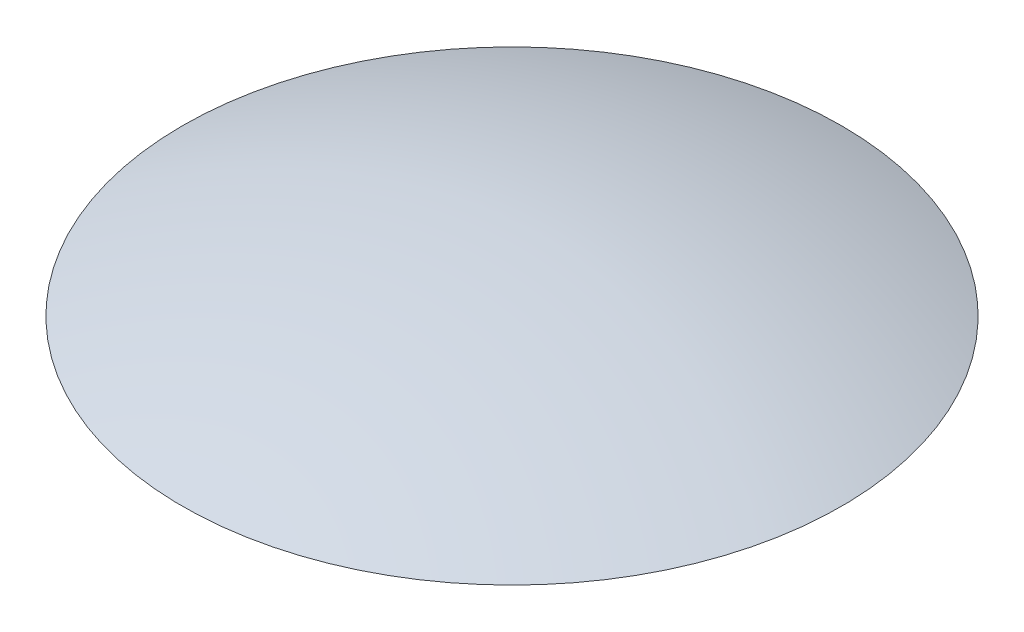
ISO-10303-21;
HEADER;
FILE_DESCRIPTION(('STEP AP214'),'2;1');
FILE_NAME('part.step','',(''),(''),'','','');
FILE_SCHEMA(('AUTOMOTIVE_DESIGN { 1 0 10303 214 1 1 1 1 }'));
ENDSEC;
DATA;
#1=APPLICATION_CONTEXT('core data for automotive mechanical design processes');
#2=APPLICATION_PROTOCOL_DEFINITION('international standard','automotive_design',2000,#1);
#3=PRODUCT_CONTEXT('',#1,'mechanical');
#4=PRODUCT('Part','Part','',(#3));
#5=PRODUCT_RELATED_PRODUCT_CATEGORY('part','',(#4));
#6=PRODUCT_DEFINITION_FORMATION('','',#4);
#7=PRODUCT_DEFINITION_CONTEXT('part definition',#1,'design');
#8=PRODUCT_DEFINITION('design','',#6,#7);
#9=PRODUCT_DEFINITION_SHAPE('','',#8);
#10=(LENGTH_UNIT() NAMED_UNIT(*) SI_UNIT(.MILLI.,.METRE.));
#11=(NAMED_UNIT(*) PLANE_ANGLE_UNIT() SI_UNIT($,.RADIAN.));
#12=(NAMED_UNIT(*) SI_UNIT($,.STERADIAN.) SOLID_ANGLE_UNIT());
#13=UNCERTAINTY_MEASURE_WITH_UNIT(LENGTH_MEASURE(1.E-05),#10,'distance_accuracy_value','');
#14=(GEOMETRIC_REPRESENTATION_CONTEXT(3) GLOBAL_UNCERTAINTY_ASSIGNED_CONTEXT((#13)) GLOBAL_UNIT_ASSIGNED_CONTEXT((#10,
#11,#12)) REPRESENTATION_CONTEXT('',''));
#15=CARTESIAN_POINT('',(0.,0.,0.));
#16=DIRECTION('',(0.,0.,1.));
#17=DIRECTION('',(1.,0.,0.));
#18=AXIS2_PLACEMENT_3D('',#15,#16,#17);
#19=CARTESIAN_POINT('',(0.,0.,0.));
#20=DIRECTION('',(0.,0.999999999999999,0.));
#21=DIRECTION('',(0.,0.,1.));
#22=AXIS2_PLACEMENT_3D('',#19,#20,#21);
#23=PLANE('',#22);
#24=CARTESIAN_POINT('',(0.,0.,0.));
#25=DIRECTION('',(0.,0.999999999999999,0.));
#26=DIRECTION('',(0.,0.,1.));
#27=AXIS2_PLACEMENT_3D('',#24,#25,#26);
#28=CIRCLE('',#27,3.);
#29=CARTESIAN_POINT('',(-1.16612303030192E-12,0.,-2.99999999999989));
#30=VERTEX_POINT('',#29);
#31=EDGE_CURVE('E45',#30,#30,#28,.T.);
#32=ORIENTED_EDGE('',*,*,#31,.F.);
#33=EDGE_LOOP('',(#32));
#34=FACE_BOUND('',#33,.T.);
#35=CARTESIAN_POINT('',(0.,0.,0.));
#36=DIRECTION('',(0.,0.999999999999999,0.));
#37=DIRECTION('',(0.,0.,1.));
#38=AXIS2_PLACEMENT_3D('',#35,#36,#37);
#39=CIRCLE('',#38,2.5);
#40=CARTESIAN_POINT('',(-1.16603976357508E-12,0.,-2.49999999999989));
#41=VERTEX_POINT('',#40);
#42=EDGE_CURVE('E87',#41,#41,#39,.T.);
#43=ORIENTED_EDGE('',*,*,#42,.T.);
#44=EDGE_LOOP('',(#43));
#45=FACE_BOUND('',#44,.T.);
#46=ADVANCED_FACE('F41',(#34,#45),#23,.F.);
#47=CARTESIAN_POINT('',(-1.16573417585641E-12,0.999999999999931,1.11022302462516E-13));
#48=DIRECTION('',(0.,-0.999999999999999,0.));
#49=DIRECTION('',(0.,0.,-1.));
#50=AXIS2_PLACEMENT_3D('',#47,#48,#49);
#51=CYLINDRICAL_SURFACE('',#50,3.);
#52=CARTESIAN_POINT('',(-1.16573417585641E-12,0.999999999999931,1.11022302462516E-13));
#53=DIRECTION('',(0.,0.999999999999999,0.));
#54=DIRECTION('',(0.,0.,1.));
#55=AXIS2_PLACEMENT_3D('',#52,#53,#54);
#56=CIRCLE('',#55,3.);
#57=CARTESIAN_POINT('',(-1.1662337762175E-12,0.999999999999931,-2.99999999999989));
#58=VERTEX_POINT('',#57);
#59=EDGE_CURVE('E11',#58,#58,#56,.T.);
#60=CARTESIAN_POINT('',(-1.1662337762175E-12,0.999999999999931,-2.99999999999989));
#61=CARTESIAN_POINT('',(-1.16623262261421E-12,0.989583333333265,-2.99999999999989));
#62=CARTESIAN_POINT('',(-1.16623146901092E-12,0.979166666666599,-2.99999999999989));
#63=CARTESIAN_POINT('',(-1.16622916180435E-12,0.958333333333267,-2.99999999999989));
#64=CARTESIAN_POINT('',(-1.16622800820106E-12,0.947916666666601,-2.99999999999989));
#65=CARTESIAN_POINT('',(-1.16622570099449E-12,0.92708333333327,-2.99999999999989));
#66=CARTESIAN_POINT('',(-1.1662245473912E-12,0.916666666666604,-2.99999999999989));
#67=CARTESIAN_POINT('',(-1.16622224018462E-12,0.895833333333272,-2.99999999999989));
#68=CARTESIAN_POINT('',(-1.16622108658134E-12,0.885416666666606,-2.99999999999989));
#69=CARTESIAN_POINT('',(-1.16621877937476E-12,0.864583333333274,-2.99999999999989));
#70=CARTESIAN_POINT('',(-1.16621762577147E-12,0.854166666666608,-2.99999999999989));
#71=CARTESIAN_POINT('',(-1.1662153185649E-12,0.833333333333276,-2.99999999999989));
#72=CARTESIAN_POINT('',(-1.16621416496161E-12,0.82291666666661,-2.99999999999989));
#73=CARTESIAN_POINT('',(-1.16621185775504E-12,0.802083333333278,-2.99999999999989));
#74=CARTESIAN_POINT('',(-1.16621070415175E-12,0.791666666666612,-2.99999999999989));
#75=CARTESIAN_POINT('',(-1.16620839694518E-12,0.77083333333328,-2.99999999999989));
#76=CARTESIAN_POINT('',(-1.16620724334189E-12,0.760416666666614,-2.99999999999989));
#77=CARTESIAN_POINT('',(-1.16620493613532E-12,0.739583333333282,-2.99999999999989));
#78=CARTESIAN_POINT('',(-1.16620378253203E-12,0.729166666666616,-2.99999999999989));
#79=CARTESIAN_POINT('',(-1.16620147532545E-12,0.708333333333284,-2.99999999999989));
#80=CARTESIAN_POINT('',(-1.16620032172217E-12,0.697916666666618,-2.99999999999989));
#81=CARTESIAN_POINT('',(-1.16619801451559E-12,0.677083333333287,-2.99999999999989));
#82=CARTESIAN_POINT('',(-1.1661968609123E-12,0.666666666666621,-2.99999999999989));
#83=CARTESIAN_POINT('',(-1.16619455370573E-12,0.645833333333289,-2.99999999999989));
#84=CARTESIAN_POINT('',(-1.16619340010244E-12,0.635416666666623,-2.99999999999989));
#85=CARTESIAN_POINT('',(-1.16619109289587E-12,0.614583333333291,-2.99999999999989));
#86=CARTESIAN_POINT('',(-1.16618993929258E-12,0.604166666666625,-2.99999999999989));
#87=CARTESIAN_POINT('',(-1.16618763208601E-12,0.583333333333293,-2.99999999999989));
#88=CARTESIAN_POINT('',(-1.16618647848272E-12,0.572916666666627,-2.99999999999989));
#89=CARTESIAN_POINT('',(-1.16618417127615E-12,0.552083333333295,-2.99999999999989));
#90=CARTESIAN_POINT('',(-1.16618301767286E-12,0.541666666666629,-2.99999999999989));
#91=CARTESIAN_POINT('',(-1.16618071046628E-12,0.520833333333297,-2.99999999999989));
#92=CARTESIAN_POINT('',(-1.166179556863E-12,0.510416666666631,-2.99999999999989));
#93=CARTESIAN_POINT('',(-1.16617724965642E-12,0.489583333333299,-2.99999999999989));
#94=CARTESIAN_POINT('',(-1.16617609605314E-12,0.479166666666633,-2.99999999999989));
#95=CARTESIAN_POINT('',(-1.16617378884656E-12,0.458333333333302,-2.99999999999989));
#96=CARTESIAN_POINT('',(-1.16617263524327E-12,0.447916666666636,-2.99999999999989));
#97=CARTESIAN_POINT('',(-1.1661703280367E-12,0.427083333333304,-2.99999999999989));
#98=CARTESIAN_POINT('',(-1.16616917443341E-12,0.416666666666638,-2.99999999999989));
#99=CARTESIAN_POINT('',(-1.16616686722684E-12,0.395833333333306,-2.99999999999989));
#100=CARTESIAN_POINT('',(-1.16616571362355E-12,0.38541666666664,-2.99999999999989));
#101=CARTESIAN_POINT('',(-1.16616340641698E-12,0.364583333333308,-2.99999999999989));
#102=CARTESIAN_POINT('',(-1.16616225281369E-12,0.354166666666642,-2.99999999999989));
#103=CARTESIAN_POINT('',(-1.16615994560711E-12,0.33333333333331,-2.99999999999989));
#104=CARTESIAN_POINT('',(-1.16615879200383E-12,0.322916666666644,-2.99999999999989));
#105=CARTESIAN_POINT('',(-1.16615648479725E-12,0.302083333333312,-2.99999999999989));
#106=CARTESIAN_POINT('',(-1.16615533119397E-12,0.291666666666646,-2.99999999999989));
#107=CARTESIAN_POINT('',(-1.16615302398739E-12,0.270833333333314,-2.99999999999989));
#108=CARTESIAN_POINT('',(-1.1661518703841E-12,0.260416666666648,-2.99999999999989));
#109=CARTESIAN_POINT('',(-1.16614956317753E-12,0.239583333333316,-2.99999999999989));
#110=CARTESIAN_POINT('',(-1.16614840957424E-12,0.229166666666651,-2.99999999999989));
#111=CARTESIAN_POINT('',(-1.16614610236767E-12,0.208333333333319,-2.99999999999989));
#112=CARTESIAN_POINT('',(-1.16614494876438E-12,0.197916666666653,-2.99999999999989));
#113=CARTESIAN_POINT('',(-1.16614264155781E-12,0.177083333333321,-2.99999999999989));
#114=CARTESIAN_POINT('',(-1.16614148795452E-12,0.166666666666655,-2.99999999999989));
#115=CARTESIAN_POINT('',(-1.16613918074794E-12,0.145833333333323,-2.99999999999989));
#116=CARTESIAN_POINT('',(-1.16613802714466E-12,0.135416666666657,-2.99999999999989));
#117=CARTESIAN_POINT('',(-1.16613571993808E-12,0.114583333333325,-2.99999999999989));
#118=CARTESIAN_POINT('',(-1.1661345663348E-12,0.104166666666659,-2.99999999999989));
#119=CARTESIAN_POINT('',(-1.16613225912822E-12,0.0833333333333271,-2.99999999999989));
#120=CARTESIAN_POINT('',(-1.16613110552493E-12,0.0729166666666612,-2.99999999999989));
#121=CARTESIAN_POINT('',(-1.16612879831836E-12,0.0520833333333293,-2.99999999999989));
#122=CARTESIAN_POINT('',(-1.16612764471507E-12,0.0416666666666633,-2.99999999999989));
#123=CARTESIAN_POINT('',(-1.1661253375085E-12,0.0208333333333314,-2.99999999999989));
#124=CARTESIAN_POINT('',(-1.16612418390521E-12,0.0104166666666655,-2.99999999999989));
#125=CARTESIAN_POINT('',(-1.16612303030192E-12,0.,-2.99999999999989));
#126=B_SPLINE_CURVE_WITH_KNOTS('',3,(#60,#61,#62,#63,#64,#65,#66,#67,#68,#69,#70,#71,#72,#73,
#74,#75,#76,#77,#78,#79,#80,#81,#82,#83,#84,#85,#86,#87,#88,#89,#90,#91,#92,#93,#94,#95,#96,#97,
#98,#99,#100,#101,#102,#103,#104,#105,#106,#107,#108,#109,#110,#111,#112,#113,#114,#115,#116,
#117,#118,#119,#120,#121,#122,#123,#124,#125),.UNSPECIFIED.,.F.,.F.,(4,2,2,2,2,2,2,2,2,2,2,2,2,
2,2,2,2,2,2,2,2,2,2,2,2,2,2,2,2,2,2,2,4),(0.,0.031249999999998,0.0624999999999958,
0.0937499999999937,0.124999999999992,0.156249999999989,0.187499999999987,0.218749999999985,
0.249999999999983,0.281249999999981,0.312499999999979,0.343749999999977,0.374999999999975,
0.406249999999972,0.43749999999997,0.468749999999968,0.499999999999966,0.531249999999964,
0.562499999999962,0.59374999999996,0.624999999999957,0.656249999999955,0.687499999999953,
0.718749999999951,0.749999999999949,0.781249999999947,0.812499999999945,0.843749999999942,
0.87499999999994,0.906249999999938,0.937499999999936,0.968749999999934,0.999999999999932),.UNSPECIFIED.);
#127=EDGE_CURVE('BSEAM43',#58,#30,#126,.T.);
#128=ORIENTED_EDGE('',*,*,#59,.F.);
#129=ORIENTED_EDGE('',*,*,#31,.T.);
#130=ORIENTED_EDGE('',*,*,#127,.T.);
#131=ORIENTED_EDGE('',*,*,#127,.F.);
#132=EDGE_LOOP('',(#128,#130,#129,#131));
#133=FACE_BOUND('',#132,.T.);
#134=ADVANCED_FACE('F43',(#133),#51,.T.);
#135=CARTESIAN_POINT('',(-1.16573417585641E-12,0.999999999999931,1.11022302462516E-13));
#136=DIRECTION('',(0.,-0.999999999999999,0.));
#137=DIRECTION('',(0.,0.,-1.));
#138=AXIS2_PLACEMENT_3D('',#135,#136,#137);
#139=CYLINDRICAL_SURFACE('',#138,2.5);
#140=CARTESIAN_POINT('',(-1.16573417585641E-12,0.999999999999931,1.11022302462516E-13));
#141=DIRECTION('',(0.,0.999999999999999,0.));
#142=DIRECTION('',(0.,0.,1.));
#143=AXIS2_PLACEMENT_3D('',#140,#141,#142);
#144=CIRCLE('',#143,2.5);
#145=CARTESIAN_POINT('',(-1.16615050949065E-12,0.999999999999931,-2.49999999999989));
#146=VERTEX_POINT('',#145);
#147=EDGE_CURVE('E84',#146,#146,#144,.T.);
#148=CARTESIAN_POINT('',(-1.16615050949065E-12,0.999999999999931,-2.49999999999989));
#149=CARTESIAN_POINT('',(-1.16614935588736E-12,0.989583333333265,-2.49999999999989));
#150=CARTESIAN_POINT('',(-1.16614820228407E-12,0.979166666666599,-2.49999999999989));
#151=CARTESIAN_POINT('',(-1.1661458950775E-12,0.958333333333267,-2.49999999999989));
#152=CARTESIAN_POINT('',(-1.16614474147421E-12,0.947916666666601,-2.49999999999989));
#153=CARTESIAN_POINT('',(-1.16614243426764E-12,0.92708333333327,-2.49999999999989));
#154=CARTESIAN_POINT('',(-1.16614128066435E-12,0.916666666666604,-2.49999999999989));
#155=CARTESIAN_POINT('',(-1.16613897345778E-12,0.895833333333272,-2.49999999999989));
#156=CARTESIAN_POINT('',(-1.16613781985449E-12,0.885416666666606,-2.49999999999989));
#157=CARTESIAN_POINT('',(-1.16613551264792E-12,0.864583333333274,-2.49999999999989));
#158=CARTESIAN_POINT('',(-1.16613435904463E-12,0.854166666666608,-2.49999999999989));
#159=CARTESIAN_POINT('',(-1.16613205183805E-12,0.833333333333276,-2.49999999999989));
#160=CARTESIAN_POINT('',(-1.16613089823477E-12,0.82291666666661,-2.49999999999989));
#161=CARTESIAN_POINT('',(-1.16612859102819E-12,0.802083333333278,-2.49999999999989));
#162=CARTESIAN_POINT('',(-1.1661274374249E-12,0.791666666666612,-2.49999999999989));
#163=CARTESIAN_POINT('',(-1.16612513021833E-12,0.77083333333328,-2.49999999999989));
#164=CARTESIAN_POINT('',(-1.16612397661504E-12,0.760416666666614,-2.49999999999989));
#165=CARTESIAN_POINT('',(-1.16612166940847E-12,0.739583333333282,-2.49999999999989));
#166=CARTESIAN_POINT('',(-1.16612051580518E-12,0.729166666666616,-2.49999999999989));
#167=CARTESIAN_POINT('',(-1.16611820859861E-12,0.708333333333284,-2.49999999999989));
#168=CARTESIAN_POINT('',(-1.16611705499532E-12,0.697916666666618,-2.49999999999989));
#169=CARTESIAN_POINT('',(-1.16611474778875E-12,0.677083333333287,-2.49999999999989));
#170=CARTESIAN_POINT('',(-1.16611359418546E-12,0.666666666666621,-2.49999999999989));
#171=CARTESIAN_POINT('',(-1.16611128697888E-12,0.645833333333289,-2.49999999999989));
#172=CARTESIAN_POINT('',(-1.1661101333756E-12,0.635416666666623,-2.49999999999989));
#173=CARTESIAN_POINT('',(-1.16610782616902E-12,0.614583333333291,-2.49999999999989));
#174=CARTESIAN_POINT('',(-1.16610667256574E-12,0.604166666666625,-2.49999999999989));
#175=CARTESIAN_POINT('',(-1.16610436535916E-12,0.583333333333293,-2.49999999999989));
#176=CARTESIAN_POINT('',(-1.16610321175587E-12,0.572916666666627,-2.49999999999989));
#177=CARTESIAN_POINT('',(-1.1661009045493E-12,0.552083333333295,-2.49999999999989));
#178=CARTESIAN_POINT('',(-1.16609975094601E-12,0.541666666666629,-2.49999999999989));
#179=CARTESIAN_POINT('',(-1.16609744373944E-12,0.520833333333297,-2.49999999999989));
#180=CARTESIAN_POINT('',(-1.16609629013615E-12,0.510416666666631,-2.49999999999989));
#181=CARTESIAN_POINT('',(-1.16609398292958E-12,0.489583333333299,-2.49999999999989));
#182=CARTESIAN_POINT('',(-1.16609282932629E-12,0.479166666666633,-2.49999999999989));
#183=CARTESIAN_POINT('',(-1.16609052211971E-12,0.458333333333302,-2.49999999999989));
#184=CARTESIAN_POINT('',(-1.16608936851643E-12,0.447916666666636,-2.49999999999989));
#185=CARTESIAN_POINT('',(-1.16608706130985E-12,0.427083333333304,-2.49999999999989));
#186=CARTESIAN_POINT('',(-1.16608590770657E-12,0.416666666666638,-2.49999999999989));
#187=CARTESIAN_POINT('',(-1.16608360049999E-12,0.395833333333306,-2.49999999999989));
#188=CARTESIAN_POINT('',(-1.1660824468967E-12,0.38541666666664,-2.49999999999989));
#189=CARTESIAN_POINT('',(-1.16608013969013E-12,0.364583333333308,-2.49999999999989));
#190=CARTESIAN_POINT('',(-1.16607898608684E-12,0.354166666666642,-2.49999999999989));
#191=CARTESIAN_POINT('',(-1.16607667888027E-12,0.33333333333331,-2.49999999999989));
#192=CARTESIAN_POINT('',(-1.16607552527698E-12,0.322916666666644,-2.49999999999989));
#193=CARTESIAN_POINT('',(-1.16607321807041E-12,0.302083333333312,-2.49999999999989));
#194=CARTESIAN_POINT('',(-1.16607206446712E-12,0.291666666666646,-2.49999999999989));
#195=CARTESIAN_POINT('',(-1.16606975726054E-12,0.270833333333314,-2.49999999999989));
#196=CARTESIAN_POINT('',(-1.16606860365726E-12,0.260416666666648,-2.49999999999989));
#197=CARTESIAN_POINT('',(-1.16606629645068E-12,0.239583333333316,-2.49999999999989));
#198=CARTESIAN_POINT('',(-1.1660651428474E-12,0.229166666666651,-2.49999999999989));
#199=CARTESIAN_POINT('',(-1.16606283564082E-12,0.208333333333319,-2.49999999999989));
#200=CARTESIAN_POINT('',(-1.16606168203753E-12,0.197916666666653,-2.49999999999989));
#201=CARTESIAN_POINT('',(-1.16605937483096E-12,0.177083333333321,-2.49999999999989));
#202=CARTESIAN_POINT('',(-1.16605822122767E-12,0.166666666666655,-2.49999999999989));
#203=CARTESIAN_POINT('',(-1.1660559140211E-12,0.145833333333323,-2.49999999999989));
#204=CARTESIAN_POINT('',(-1.16605476041781E-12,0.135416666666657,-2.49999999999989));
#205=CARTESIAN_POINT('',(-1.16605245321124E-12,0.114583333333325,-2.49999999999989));
#206=CARTESIAN_POINT('',(-1.16605129960795E-12,0.104166666666659,-2.49999999999989));
#207=CARTESIAN_POINT('',(-1.16604899240137E-12,0.0833333333333271,-2.49999999999989));
#208=CARTESIAN_POINT('',(-1.16604783879809E-12,0.0729166666666612,-2.49999999999989));
#209=CARTESIAN_POINT('',(-1.16604553159151E-12,0.0520833333333293,-2.49999999999989));
#210=CARTESIAN_POINT('',(-1.16604437798823E-12,0.0416666666666633,-2.49999999999989));
#211=CARTESIAN_POINT('',(-1.16604207078165E-12,0.0208333333333314,-2.49999999999989));
#212=CARTESIAN_POINT('',(-1.16604091717836E-12,0.0104166666666655,-2.49999999999989));
#213=CARTESIAN_POINT('',(-1.16603976357508E-12,0.,-2.49999999999989));
#214=B_SPLINE_CURVE_WITH_KNOTS('',3,(#148,#149,#150,#151,#152,#153,#154,#155,#156,#157,#158,
#159,#160,#161,#162,#163,#164,#165,#166,#167,#168,#169,#170,#171,#172,#173,#174,#175,#176,#177,
#178,#179,#180,#181,#182,#183,#184,#185,#186,#187,#188,#189,#190,#191,#192,#193,#194,#195,#196,
#197,#198,#199,#200,#201,#202,#203,#204,#205,#206,#207,#208,#209,#210,#211,#212,#213),
.UNSPECIFIED.,.F.,.F.,(4,2,2,2,2,2,2,2,2,2,2,2,2,2,2,2,2,2,2,2,2,2,2,2,2,2,2,2,2,2,2,2,4),(0.,
0.031249999999998,0.0624999999999958,0.0937499999999937,0.124999999999992,0.156249999999989,
0.187499999999987,0.218749999999985,0.249999999999983,0.281249999999981,0.312499999999979,
0.343749999999977,0.374999999999975,0.406249999999972,0.43749999999997,0.468749999999968,
0.499999999999966,0.531249999999964,0.562499999999962,0.59374999999996,0.624999999999957,
0.656249999999955,0.687499999999953,0.718749999999951,0.749999999999949,0.781249999999947,
0.812499999999945,0.843749999999942,0.87499999999994,0.906249999999938,0.937499999999936,
0.968749999999934,0.999999999999932),.UNSPECIFIED.);
#215=EDGE_CURVE('BSEAM64',#146,#41,#214,.T.);
#216=ORIENTED_EDGE('',*,*,#147,.T.);
#217=ORIENTED_EDGE('',*,*,#42,.F.);
#218=ORIENTED_EDGE('',*,*,#215,.T.);
#219=ORIENTED_EDGE('',*,*,#215,.F.);
#220=EDGE_LOOP('',(#216,#218,#217,#219));
#221=FACE_BOUND('',#220,.T.);
#222=ADVANCED_FACE('F64',(#221),#139,.F.);
#223=CARTESIAN_POINT('',(-1.16573417585641E-12,0.999999999999931,1.11022302462516E-13));
#224=DIRECTION('',(0.,0.999999999999999,0.));
#225=DIRECTION('',(0.,0.,1.));
#226=AXIS2_PLACEMENT_3D('',#223,#224,#225);
#227=PLANE('',#226);
#228=ORIENTED_EDGE('',*,*,#147,.F.);
#229=EDGE_LOOP('',(#228));
#230=FACE_BOUND('',#229,.T.);
#231=ADVANCED_FACE('F55',(#230),#227,.F.);
#232=CARTESIAN_POINT('',(-6.66133814775094E-13,1.99999999999975,4.44089209850063E-13));
#233=CARTESIAN_POINT('',(-2.50000000000106,1.99999999999988,0.));
#234=CARTESIAN_POINT('',(-5.00000000000006,0.999999999999987,0.));
#235=B_SPLINE_CURVE_WITH_KNOTS('',2,(#232,#233,#234),.UNSPECIFIED.,.F.,.F.,(3,3),(0.,
0.500000000000018),.UNSPECIFIED.);
#236=CARTESIAN_POINT('',(0.,0.,0.));
#237=DIRECTION('',(0.,-0.999999999999999,0.));
#238=AXIS1_PLACEMENT('',#236,#237);
#239=SURFACE_OF_REVOLUTION('',#235,#238);
#240=CARTESIAN_POINT('',(-1.16573417585641E-12,0.999999999999931,1.11022302462516E-13));
#241=DIRECTION('',(0.,-0.999999999999999,0.));
#242=DIRECTION('',(0.,0.,-1.));
#243=AXIS2_PLACEMENT_3D('',#240,#241,#242);
#244=CIRCLE('',#243,5.);
#245=CARTESIAN_POINT('',(-1.16656684312488E-12,0.999999999999931,-4.99999999999989));
#246=VERTEX_POINT('',#245);
#247=EDGE_CURVE('E94',#246,#246,#244,.T.);
#248=ORIENTED_EDGE('',*,*,#247,.F.);
#249=EDGE_LOOP('',(#248));
#250=FACE_BOUND('',#249,.T.);
#251=CARTESIAN_POINT('',(-6.66133814775094E-13,1.99999999999975,4.44089209850063E-13));
#252=VERTEX_POINT('',#251);
#253=VERTEX_LOOP('',#252);
#254=FACE_BOUND('',#253,.T.);
#255=ADVANCED_FACE('F52',(#250,#254),#239,.T.);
#256=ORIENTED_EDGE('',*,*,#59,.T.);
#257=EDGE_LOOP('',(#256));
#258=FACE_BOUND('',#257,.T.);
#259=ORIENTED_EDGE('',*,*,#247,.T.);
#260=EDGE_LOOP('',(#259));
#261=FACE_BOUND('',#260,.T.);
#262=ADVANCED_FACE('F54',(#258,#261),#227,.F.);
#263=CLOSED_SHELL('',(#46,#134,#222,#231,#255,#262));
#264=MANIFOLD_SOLID_BREP('B2',#263);
#265=ADVANCED_BREP_SHAPE_REPRESENTATION('',(#18,#264),#14);
#266=SHAPE_DEFINITION_REPRESENTATION(#9,#265);
ENDSEC;
END-ISO-10303-21;
